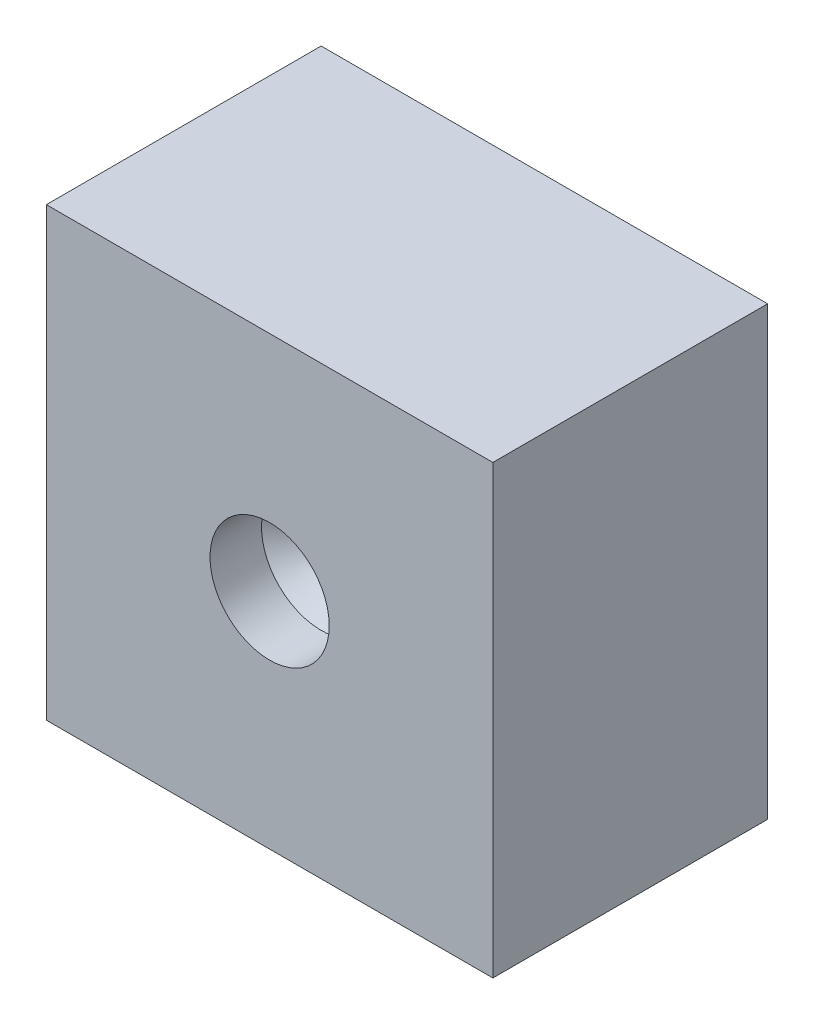
ISO-10303-21;
HEADER;
FILE_DESCRIPTION(('STEP AP214'),'2;1');
FILE_NAME('part.step','',(''),(''),'','','');
FILE_SCHEMA(('AUTOMOTIVE_DESIGN { 1 0 10303 214 1 1 1 1 }'));
ENDSEC;
DATA;
#1=APPLICATION_CONTEXT('core data for automotive mechanical design processes');
#2=APPLICATION_PROTOCOL_DEFINITION('international standard','automotive_design',2000,#1);
#3=PRODUCT_CONTEXT('',#1,'mechanical');
#4=PRODUCT('Part','Part','',(#3));
#5=PRODUCT_RELATED_PRODUCT_CATEGORY('part','',(#4));
#6=PRODUCT_DEFINITION_FORMATION('','',#4);
#7=PRODUCT_DEFINITION_CONTEXT('part definition',#1,'design');
#8=PRODUCT_DEFINITION('design','',#6,#7);
#9=PRODUCT_DEFINITION_SHAPE('','',#8);
#10=(LENGTH_UNIT() NAMED_UNIT(*) SI_UNIT(.MILLI.,.METRE.));
#11=(NAMED_UNIT(*) PLANE_ANGLE_UNIT() SI_UNIT($,.RADIAN.));
#12=(NAMED_UNIT(*) SI_UNIT($,.STERADIAN.) SOLID_ANGLE_UNIT());
#13=UNCERTAINTY_MEASURE_WITH_UNIT(LENGTH_MEASURE(1.E-05),#10,'distance_accuracy_value','');
#14=(GEOMETRIC_REPRESENTATION_CONTEXT(3) GLOBAL_UNCERTAINTY_ASSIGNED_CONTEXT((#13)) GLOBAL_UNIT_ASSIGNED_CONTEXT((#10,
#11,#12)) REPRESENTATION_CONTEXT('',''));
#15=CARTESIAN_POINT('',(0.,0.,0.));
#16=DIRECTION('',(0.,0.,1.));
#17=DIRECTION('',(1.,0.,0.));
#18=AXIS2_PLACEMENT_3D('',#15,#16,#17);
#19=CARTESIAN_POINT('',(13.,13.,16.));
#20=DIRECTION('',(0.,-1.,0.));
#21=DIRECTION('',(1.,0.,0.));
#22=AXIS2_PLACEMENT_3D('',#19,#20,#21);
#23=PLANE('',#22);
#24=DIRECTION('',(-1.,0.,0.));
#25=VECTOR('',#24,1.);
#26=CARTESIAN_POINT('',(13.,13.,0.));
#27=LINE('',#26,#25);
#28=CARTESIAN_POINT('',(13.,13.,0.));
#29=VERTEX_POINT('',#28);
#30=CARTESIAN_POINT('',(-13.,13.,0.));
#31=VERTEX_POINT('',#30);
#32=EDGE_CURVE('E115',#29,#31,#27,.T.);
#33=ORIENTED_EDGE('',*,*,#32,.T.);
#34=DIRECTION('',(0.,0.,-1.));
#35=VECTOR('',#34,1.);
#36=CARTESIAN_POINT('',(-13.,13.,16.));
#37=LINE('',#36,#35);
#38=CARTESIAN_POINT('',(-13.,13.,16.));
#39=VERTEX_POINT('',#38);
#40=EDGE_CURVE('E11',#39,#31,#37,.T.);
#41=ORIENTED_EDGE('',*,*,#40,.F.);
#42=DIRECTION('',(-1.,0.,0.));
#43=VECTOR('',#42,1.);
#44=CARTESIAN_POINT('',(13.,13.,16.));
#45=LINE('',#44,#43);
#46=CARTESIAN_POINT('',(13.,13.,16.));
#47=VERTEX_POINT('',#46);
#48=EDGE_CURVE('E99',#47,#39,#45,.T.);
#49=ORIENTED_EDGE('',*,*,#48,.F.);
#50=DIRECTION('',(0.,0.,-1.));
#51=VECTOR('',#50,1.);
#52=CARTESIAN_POINT('',(13.,13.,16.));
#53=LINE('',#52,#51);
#54=EDGE_CURVE('E111',#47,#29,#53,.T.);
#55=ORIENTED_EDGE('',*,*,#54,.T.);
#56=EDGE_LOOP('',(#33,#41,#49,#55));
#57=FACE_BOUND('',#56,.T.);
#58=ADVANCED_FACE('F47',(#57),#23,.F.);
#59=CARTESIAN_POINT('',(-13.,-13.,16.));
#60=DIRECTION('',(1.,0.,0.));
#61=DIRECTION('',(0.,0.,-1.));
#62=AXIS2_PLACEMENT_3D('',#59,#60,#61);
#63=PLANE('',#62);
#64=DIRECTION('',(0.,-1.,0.));
#65=VECTOR('',#64,1.);
#66=CARTESIAN_POINT('',(-13.,-13.,0.));
#67=LINE('',#66,#65);
#68=CARTESIAN_POINT('',(-13.,-13.,0.));
#69=VERTEX_POINT('',#68);
#70=EDGE_CURVE('E104',#31,#69,#67,.T.);
#71=ORIENTED_EDGE('',*,*,#70,.T.);
#72=DIRECTION('',(0.,0.,-1.));
#73=VECTOR('',#72,1.);
#74=CARTESIAN_POINT('',(-13.,-13.,16.));
#75=LINE('',#74,#73);
#76=CARTESIAN_POINT('',(-13.,-13.,16.));
#77=VERTEX_POINT('',#76);
#78=EDGE_CURVE('E56',#77,#69,#75,.T.);
#79=ORIENTED_EDGE('',*,*,#78,.F.);
#80=DIRECTION('',(0.,-1.,0.));
#81=VECTOR('',#80,1.);
#82=CARTESIAN_POINT('',(-13.,-13.,16.));
#83=LINE('',#82,#81);
#84=EDGE_CURVE('E94',#39,#77,#83,.T.);
#85=ORIENTED_EDGE('',*,*,#84,.F.);
#86=ORIENTED_EDGE('',*,*,#40,.T.);
#87=EDGE_LOOP('',(#71,#79,#85,#86));
#88=FACE_BOUND('',#87,.T.);
#89=ADVANCED_FACE('F103',(#88),#63,.F.);
#90=CARTESIAN_POINT('',(13.,-13.,16.));
#91=DIRECTION('',(0.,1.,0.));
#92=DIRECTION('',(0.,0.,1.));
#93=AXIS2_PLACEMENT_3D('',#90,#91,#92);
#94=PLANE('',#93);
#95=DIRECTION('',(1.,0.,0.));
#96=VECTOR('',#95,1.);
#97=CARTESIAN_POINT('',(13.,-13.,0.));
#98=LINE('',#97,#96);
#99=CARTESIAN_POINT('',(13.,-13.,0.));
#100=VERTEX_POINT('',#99);
#101=EDGE_CURVE('E81',#69,#100,#98,.T.);
#102=ORIENTED_EDGE('',*,*,#101,.T.);
#103=DIRECTION('',(0.,0.,-1.));
#104=VECTOR('',#103,1.);
#105=CARTESIAN_POINT('',(13.,-13.,16.));
#106=LINE('',#105,#104);
#107=CARTESIAN_POINT('',(13.,-13.,16.));
#108=VERTEX_POINT('',#107);
#109=EDGE_CURVE('E106',#108,#100,#106,.T.);
#110=ORIENTED_EDGE('',*,*,#109,.F.);
#111=DIRECTION('',(1.,0.,0.));
#112=VECTOR('',#111,1.);
#113=CARTESIAN_POINT('',(13.,-13.,16.));
#114=LINE('',#113,#112);
#115=EDGE_CURVE('E97',#77,#108,#114,.T.);
#116=ORIENTED_EDGE('',*,*,#115,.F.);
#117=ORIENTED_EDGE('',*,*,#78,.T.);
#118=EDGE_LOOP('',(#102,#110,#116,#117));
#119=FACE_BOUND('',#118,.T.);
#120=ADVANCED_FACE('F107',(#119),#94,.F.);
#121=CARTESIAN_POINT('',(13.,-13.,16.));
#122=DIRECTION('',(-1.,0.,0.));
#123=DIRECTION('',(0.,-1.,0.));
#124=AXIS2_PLACEMENT_3D('',#121,#122,#123);
#125=PLANE('',#124);
#126=DIRECTION('',(0.,1.,0.));
#127=VECTOR('',#126,1.);
#128=CARTESIAN_POINT('',(13.,-13.,0.));
#129=LINE('',#128,#127);
#130=EDGE_CURVE('E87',#100,#29,#129,.T.);
#131=ORIENTED_EDGE('',*,*,#130,.T.);
#132=ORIENTED_EDGE('',*,*,#54,.F.);
#133=DIRECTION('',(0.,1.,0.));
#134=VECTOR('',#133,1.);
#135=CARTESIAN_POINT('',(13.,-13.,16.));
#136=LINE('',#135,#134);
#137=EDGE_CURVE('E64',#108,#47,#136,.T.);
#138=ORIENTED_EDGE('',*,*,#137,.F.);
#139=ORIENTED_EDGE('',*,*,#109,.T.);
#140=EDGE_LOOP('',(#131,#132,#138,#139));
#141=FACE_BOUND('',#140,.T.);
#142=ADVANCED_FACE('F129',(#141),#125,.F.);
#143=CARTESIAN_POINT('',(0.,0.,16.));
#144=DIRECTION('',(0.,0.,-1.));
#145=DIRECTION('',(-1.,0.,0.));
#146=AXIS2_PLACEMENT_3D('',#143,#144,#145);
#147=PLANE('',#146);
#148=CARTESIAN_POINT('',(0.,0.,16.));
#149=DIRECTION('',(0.,0.,1.));
#150=DIRECTION('',(1.,0.,0.));
#151=AXIS2_PLACEMENT_3D('',#148,#149,#150);
#152=CIRCLE('',#151,3.47);
#153=CARTESIAN_POINT('',(3.47,0.,16.));
#154=VERTEX_POINT('',#153);
#155=EDGE_CURVE('E147',#154,#154,#152,.T.);
#156=ORIENTED_EDGE('',*,*,#155,.F.);
#157=EDGE_LOOP('',(#156));
#158=FACE_BOUND('',#157,.T.);
#159=ORIENTED_EDGE('',*,*,#48,.T.);
#160=ORIENTED_EDGE('',*,*,#84,.T.);
#161=ORIENTED_EDGE('',*,*,#115,.T.);
#162=ORIENTED_EDGE('',*,*,#137,.T.);
#163=EDGE_LOOP('',(#159,#160,#161,#162));
#164=FACE_BOUND('',#163,.T.);
#165=ADVANCED_FACE('F95',(#158,#164),#147,.F.);
#166=CARTESIAN_POINT('',(0.,0.,0.));
#167=DIRECTION('',(0.,0.,-1.));
#168=DIRECTION('',(-1.,0.,0.));
#169=AXIS2_PLACEMENT_3D('',#166,#167,#168);
#170=PLANE('',#169);
#171=CARTESIAN_POINT('',(0.,0.,0.));
#172=DIRECTION('',(0.,0.,1.));
#173=DIRECTION('',(1.,0.,0.));
#174=AXIS2_PLACEMENT_3D('',#171,#172,#173);
#175=CIRCLE('',#174,1.70000000000001);
#176=CARTESIAN_POINT('',(1.70000000000001,0.,0.));
#177=VERTEX_POINT('',#176);
#178=EDGE_CURVE('E119',#177,#177,#175,.T.);
#179=ORIENTED_EDGE('',*,*,#178,.T.);
#180=EDGE_LOOP('',(#179));
#181=FACE_BOUND('',#180,.T.);
#182=ORIENTED_EDGE('',*,*,#32,.F.);
#183=ORIENTED_EDGE('',*,*,#130,.F.);
#184=ORIENTED_EDGE('',*,*,#101,.F.);
#185=ORIENTED_EDGE('',*,*,#70,.F.);
#186=EDGE_LOOP('',(#182,#183,#184,#185));
#187=FACE_BOUND('',#186,.T.);
#188=ADVANCED_FACE('F132',(#181,#187),#170,.T.);
#189=CARTESIAN_POINT('',(0.,0.,16.));
#190=DIRECTION('',(0.,0.,1.));
#191=DIRECTION('',(1.,0.,0.));
#192=AXIS2_PLACEMENT_3D('',#189,#190,#191);
#193=CYLINDRICAL_SURFACE('',#192,1.7);
#194=ORIENTED_EDGE('',*,*,#178,.F.);
#195=EDGE_LOOP('',(#194));
#196=FACE_BOUND('',#195,.T.);
#197=CARTESIAN_POINT('',(0.,0.,11.23));
#198=DIRECTION('',(0.,0.,1.));
#199=DIRECTION('',(1.,0.,0.));
#200=AXIS2_PLACEMENT_3D('',#197,#198,#199);
#201=CIRCLE('',#200,1.7);
#202=CARTESIAN_POINT('',(1.7,0.,11.23));
#203=VERTEX_POINT('',#202);
#204=EDGE_CURVE('E139',#203,#203,#201,.T.);
#205=ORIENTED_EDGE('',*,*,#204,.T.);
#206=EDGE_LOOP('',(#205));
#207=FACE_BOUND('',#206,.T.);
#208=ADVANCED_FACE('F160',(#196,#207),#193,.F.);
#209=CARTESIAN_POINT('',(0.,0.,13.));
#210=DIRECTION('',(0.,0.,1.));
#211=DIRECTION('',(1.,0.,0.));
#212=AXIS2_PLACEMENT_3D('',#209,#210,#211);
#213=CONICAL_SURFACE('',#212,3.47,0.785398163397449);
#214=ORIENTED_EDGE('',*,*,#204,.F.);
#215=EDGE_LOOP('',(#214));
#216=FACE_BOUND('',#215,.T.);
#217=CARTESIAN_POINT('',(0.,0.,13.));
#218=DIRECTION('',(0.,0.,1.));
#219=DIRECTION('',(1.,0.,0.));
#220=AXIS2_PLACEMENT_3D('',#217,#218,#219);
#221=CIRCLE('',#220,3.47);
#222=CARTESIAN_POINT('',(3.47,0.,13.));
#223=VERTEX_POINT('',#222);
#224=EDGE_CURVE('E143',#223,#223,#221,.T.);
#225=ORIENTED_EDGE('',*,*,#224,.T.);
#226=EDGE_LOOP('',(#225));
#227=FACE_BOUND('',#226,.T.);
#228=ADVANCED_FACE('F200',(#216,#227),#213,.F.);
#229=CARTESIAN_POINT('',(0.,0.,16.));
#230=DIRECTION('',(0.,0.,1.));
#231=DIRECTION('',(1.,0.,0.));
#232=AXIS2_PLACEMENT_3D('',#229,#230,#231);
#233=CYLINDRICAL_SURFACE('',#232,3.47);
#234=ORIENTED_EDGE('',*,*,#224,.F.);
#235=EDGE_LOOP('',(#234));
#236=FACE_BOUND('',#235,.T.);
#237=ORIENTED_EDGE('',*,*,#155,.T.);
#238=EDGE_LOOP('',(#237));
#239=FACE_BOUND('',#238,.T.);
#240=ADVANCED_FACE('F152',(#236,#239),#233,.F.);
#241=CLOSED_SHELL('',(#58,#89,#120,#142,#165,#188,#208,#228,#240));
#242=MANIFOLD_SOLID_BREP('B2',#241);
#243=ADVANCED_BREP_SHAPE_REPRESENTATION('',(#18,#242),#14);
#244=SHAPE_DEFINITION_REPRESENTATION(#9,#243);
ENDSEC;
END-ISO-10303-21;
